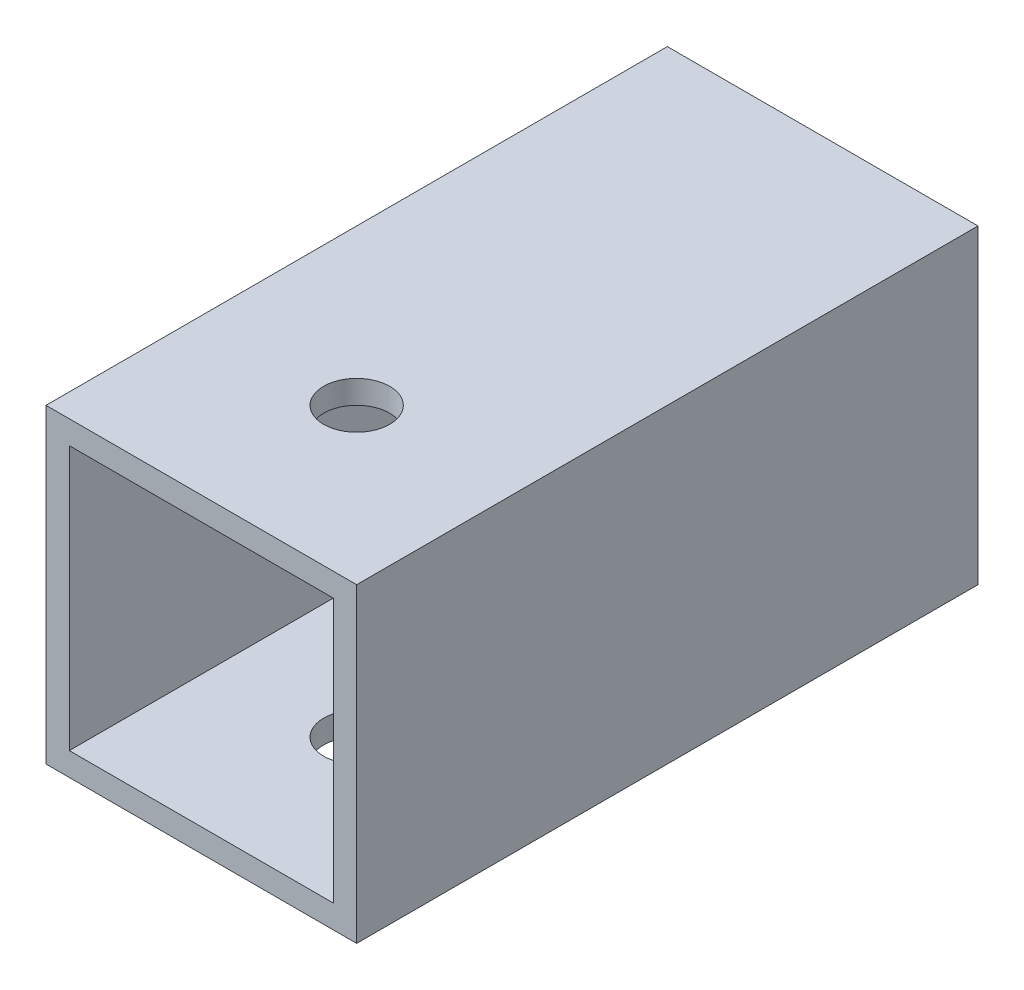
ISO-10303-21;
HEADER;
FILE_DESCRIPTION(('STEP AP214'),'2;1');
FILE_NAME('part.step','',(''),(''),'','','');
FILE_SCHEMA(('AUTOMOTIVE_DESIGN { 1 0 10303 214 1 1 1 1 }'));
ENDSEC;
DATA;
#1=APPLICATION_CONTEXT('core data for automotive mechanical design processes');
#2=APPLICATION_PROTOCOL_DEFINITION('international standard','automotive_design',2000,#1);
#3=PRODUCT_CONTEXT('',#1,'mechanical');
#4=PRODUCT('Part','Part','',(#3));
#5=PRODUCT_RELATED_PRODUCT_CATEGORY('part','',(#4));
#6=PRODUCT_DEFINITION_FORMATION('','',#4);
#7=PRODUCT_DEFINITION_CONTEXT('part definition',#1,'design');
#8=PRODUCT_DEFINITION('design','',#6,#7);
#9=PRODUCT_DEFINITION_SHAPE('','',#8);
#10=(LENGTH_UNIT() NAMED_UNIT(*) SI_UNIT(.MILLI.,.METRE.));
#11=(NAMED_UNIT(*) PLANE_ANGLE_UNIT() SI_UNIT($,.RADIAN.));
#12=(NAMED_UNIT(*) SI_UNIT($,.STERADIAN.) SOLID_ANGLE_UNIT());
#13=UNCERTAINTY_MEASURE_WITH_UNIT(LENGTH_MEASURE(1.E-05),#10,'distance_accuracy_value','');
#14=(GEOMETRIC_REPRESENTATION_CONTEXT(3) GLOBAL_UNCERTAINTY_ASSIGNED_CONTEXT((#13)) GLOBAL_UNIT_ASSIGNED_CONTEXT((#10,
#11,#12)) REPRESENTATION_CONTEXT('',''));
#15=CARTESIAN_POINT('',(0.,0.,0.));
#16=DIRECTION('',(0.,0.,1.));
#17=DIRECTION('',(1.,0.,0.));
#18=AXIS2_PLACEMENT_3D('',#15,#16,#17);
#19=CARTESIAN_POINT('',(10.,-9.99999999999999,-40.));
#20=DIRECTION('',(1.,0.,0.));
#21=DIRECTION('',(0.,0.,-1.));
#22=AXIS2_PLACEMENT_3D('',#19,#20,#21);
#23=PLANE('',#22);
#24=DIRECTION('',(0.,1.,0.));
#25=VECTOR('',#24,1.);
#26=CARTESIAN_POINT('',(10.,-9.99999999999999,0.));
#27=LINE('',#26,#25);
#28=CARTESIAN_POINT('',(10.,-9.99999999999999,0.));
#29=VERTEX_POINT('',#28);
#30=CARTESIAN_POINT('',(10.,10.,0.));
#31=VERTEX_POINT('',#30);
#32=EDGE_CURVE('E144',#29,#31,#27,.T.);
#33=ORIENTED_EDGE('',*,*,#32,.F.);
#34=DIRECTION('',(0.,0.,1.));
#35=VECTOR('',#34,1.);
#36=CARTESIAN_POINT('',(10.,-9.99999999999999,-40.));
#37=LINE('',#36,#35);
#38=CARTESIAN_POINT('',(10.,-9.99999999999999,-40.));
#39=VERTEX_POINT('',#38);
#40=EDGE_CURVE('E11',#39,#29,#37,.T.);
#41=ORIENTED_EDGE('',*,*,#40,.F.);
#42=DIRECTION('',(0.,1.,0.));
#43=VECTOR('',#42,1.);
#44=CARTESIAN_POINT('',(10.,-9.99999999999999,-40.));
#45=LINE('',#44,#43);
#46=CARTESIAN_POINT('',(10.,10.,-40.));
#47=VERTEX_POINT('',#46);
#48=EDGE_CURVE('E148',#39,#47,#45,.T.);
#49=ORIENTED_EDGE('',*,*,#48,.T.);
#50=DIRECTION('',(0.,0.,1.));
#51=VECTOR('',#50,1.);
#52=CARTESIAN_POINT('',(10.,10.,-40.));
#53=LINE('',#52,#51);
#54=EDGE_CURVE('E161',#47,#31,#53,.T.);
#55=ORIENTED_EDGE('',*,*,#54,.T.);
#56=EDGE_LOOP('',(#33,#41,#49,#55));
#57=FACE_BOUND('',#56,.T.);
#58=ADVANCED_FACE('F43',(#57),#23,.T.);
#59=CARTESIAN_POINT('',(-9.99999999999998,-9.99999999999999,-40.));
#60=DIRECTION('',(0.,-1.,0.));
#61=DIRECTION('',(0.,0.,-1.));
#62=AXIS2_PLACEMENT_3D('',#59,#60,#61);
#63=PLANE('',#62);
#64=CARTESIAN_POINT('',(0.,-9.99999999999999,-10.));
#65=DIRECTION('',(0.,1.,0.));
#66=DIRECTION('',(0.,0.,1.));
#67=AXIS2_PLACEMENT_3D('',#64,#65,#66);
#68=CIRCLE('',#67,2.125);
#69=CARTESIAN_POINT('',(0.,-9.99999999999999,-7.875));
#70=VERTEX_POINT('',#69);
#71=EDGE_CURVE('E302',#70,#70,#68,.T.);
#72=ORIENTED_EDGE('',*,*,#71,.T.);
#73=EDGE_LOOP('',(#72));
#74=FACE_BOUND('',#73,.T.);
#75=DIRECTION('',(1.,0.,0.));
#76=VECTOR('',#75,1.);
#77=CARTESIAN_POINT('',(-9.99999999999998,-9.99999999999999,0.));
#78=LINE('',#77,#76);
#79=CARTESIAN_POINT('',(-9.99999999999998,-9.99999999999999,0.));
#80=VERTEX_POINT('',#79);
#81=EDGE_CURVE('E152',#80,#29,#78,.T.);
#82=ORIENTED_EDGE('',*,*,#81,.F.);
#83=DIRECTION('',(0.,0.,1.));
#84=VECTOR('',#83,1.);
#85=CARTESIAN_POINT('',(-9.99999999999998,-9.99999999999999,-40.));
#86=LINE('',#85,#84);
#87=CARTESIAN_POINT('',(-9.99999999999998,-9.99999999999999,-40.));
#88=VERTEX_POINT('',#87);
#89=EDGE_CURVE('E51',#88,#80,#86,.T.);
#90=ORIENTED_EDGE('',*,*,#89,.F.);
#91=DIRECTION('',(1.,0.,0.));
#92=VECTOR('',#91,1.);
#93=CARTESIAN_POINT('',(-9.99999999999998,-9.99999999999999,-40.));
#94=LINE('',#93,#92);
#95=EDGE_CURVE('E158',#88,#39,#94,.T.);
#96=ORIENTED_EDGE('',*,*,#95,.T.);
#97=ORIENTED_EDGE('',*,*,#40,.T.);
#98=EDGE_LOOP('',(#82,#90,#96,#97));
#99=FACE_BOUND('',#98,.T.);
#100=ADVANCED_FACE('F186',(#74,#99),#63,.T.);
#101=CARTESIAN_POINT('',(-9.99999999999998,-9.99999999999999,-40.));
#102=DIRECTION('',(-1.,0.,0.));
#103=DIRECTION('',(0.,0.,1.));
#104=AXIS2_PLACEMENT_3D('',#101,#102,#103);
#105=PLANE('',#104);
#106=DIRECTION('',(0.,-1.,0.));
#107=VECTOR('',#106,1.);
#108=CARTESIAN_POINT('',(-9.99999999999998,-9.99999999999999,0.));
#109=LINE('',#108,#107);
#110=CARTESIAN_POINT('',(-9.99999999999998,10.,0.));
#111=VERTEX_POINT('',#110);
#112=EDGE_CURVE('E167',#111,#80,#109,.T.);
#113=ORIENTED_EDGE('',*,*,#112,.F.);
#114=DIRECTION('',(0.,0.,1.));
#115=VECTOR('',#114,1.);
#116=CARTESIAN_POINT('',(-9.99999999999998,10.,-40.));
#117=LINE('',#116,#115);
#118=CARTESIAN_POINT('',(-9.99999999999998,10.,-40.));
#119=VERTEX_POINT('',#118);
#120=EDGE_CURVE('E173',#119,#111,#117,.T.);
#121=ORIENTED_EDGE('',*,*,#120,.F.);
#122=DIRECTION('',(0.,-1.,0.));
#123=VECTOR('',#122,1.);
#124=CARTESIAN_POINT('',(-9.99999999999998,-9.99999999999999,-40.));
#125=LINE('',#124,#123);
#126=EDGE_CURVE('E155',#119,#88,#125,.T.);
#127=ORIENTED_EDGE('',*,*,#126,.T.);
#128=ORIENTED_EDGE('',*,*,#89,.T.);
#129=EDGE_LOOP('',(#113,#121,#127,#128));
#130=FACE_BOUND('',#129,.T.);
#131=ADVANCED_FACE('F190',(#130),#105,.T.);
#132=CARTESIAN_POINT('',(-9.99999999999998,10.,-40.));
#133=DIRECTION('',(0.,1.,0.));
#134=DIRECTION('',(0.,0.,1.));
#135=AXIS2_PLACEMENT_3D('',#132,#133,#134);
#136=PLANE('',#135);
#137=CARTESIAN_POINT('',(0.,10.,-10.));
#138=DIRECTION('',(0.,1.,0.));
#139=DIRECTION('',(0.,0.,1.));
#140=AXIS2_PLACEMENT_3D('',#137,#138,#139);
#141=CIRCLE('',#140,2.125);
#142=CARTESIAN_POINT('',(0.,10.,-7.875));
#143=VERTEX_POINT('',#142);
#144=EDGE_CURVE('E298',#143,#143,#141,.T.);
#145=ORIENTED_EDGE('',*,*,#144,.F.);
#146=EDGE_LOOP('',(#145));
#147=FACE_BOUND('',#146,.T.);
#148=DIRECTION('',(-1.,0.,0.));
#149=VECTOR('',#148,1.);
#150=CARTESIAN_POINT('',(-9.99999999999998,10.,0.));
#151=LINE('',#150,#149);
#152=EDGE_CURVE('E164',#31,#111,#151,.T.);
#153=ORIENTED_EDGE('',*,*,#152,.F.);
#154=ORIENTED_EDGE('',*,*,#54,.F.);
#155=DIRECTION('',(-1.,0.,0.));
#156=VECTOR('',#155,1.);
#157=CARTESIAN_POINT('',(-9.99999999999998,10.,-40.));
#158=LINE('',#157,#156);
#159=EDGE_CURVE('E151',#47,#119,#158,.T.);
#160=ORIENTED_EDGE('',*,*,#159,.T.);
#161=ORIENTED_EDGE('',*,*,#120,.T.);
#162=EDGE_LOOP('',(#153,#154,#160,#161));
#163=FACE_BOUND('',#162,.T.);
#164=ADVANCED_FACE('F180',(#147,#163),#136,.T.);
#165=CARTESIAN_POINT('',(0.,0.,-40.));
#166=DIRECTION('',(0.,0.,-1.));
#167=DIRECTION('',(-1.,0.,0.));
#168=AXIS2_PLACEMENT_3D('',#165,#166,#167);
#169=PLANE('',#168);
#170=DIRECTION('',(0.,-1.,0.));
#171=VECTOR('',#170,1.);
#172=CARTESIAN_POINT('',(-8.49999999999998,-8.49999999999999,-40.));
#173=LINE('',#172,#171);
#174=CARTESIAN_POINT('',(-8.49999999999998,8.50000000000002,-40.));
#175=VERTEX_POINT('',#174);
#176=CARTESIAN_POINT('',(-8.49999999999998,-8.49999999999999,-40.));
#177=VERTEX_POINT('',#176);
#178=EDGE_CURVE('E110',#175,#177,#173,.T.);
#179=ORIENTED_EDGE('',*,*,#178,.T.);
#180=DIRECTION('',(1.,0.,0.));
#181=VECTOR('',#180,1.);
#182=CARTESIAN_POINT('',(-8.49999999999998,-8.49999999999999,-40.));
#183=LINE('',#182,#181);
#184=CARTESIAN_POINT('',(8.50000000000002,-8.49999999999999,-40.));
#185=VERTEX_POINT('',#184);
#186=EDGE_CURVE('E119',#177,#185,#183,.T.);
#187=ORIENTED_EDGE('',*,*,#186,.T.);
#188=DIRECTION('',(0.,1.,0.));
#189=VECTOR('',#188,1.);
#190=CARTESIAN_POINT('',(8.50000000000002,-8.49999999999999,-40.));
#191=LINE('',#190,#189);
#192=CARTESIAN_POINT('',(8.50000000000002,8.50000000000002,-40.));
#193=VERTEX_POINT('',#192);
#194=EDGE_CURVE('E59',#185,#193,#191,.T.);
#195=ORIENTED_EDGE('',*,*,#194,.T.);
#196=DIRECTION('',(-1.,0.,0.));
#197=VECTOR('',#196,1.);
#198=CARTESIAN_POINT('',(-8.49999999999998,8.50000000000002,-40.));
#199=LINE('',#198,#197);
#200=EDGE_CURVE('E116',#193,#175,#199,.T.);
#201=ORIENTED_EDGE('',*,*,#200,.T.);
#202=EDGE_LOOP('',(#179,#187,#195,#201));
#203=FACE_BOUND('',#202,.T.);
#204=ORIENTED_EDGE('',*,*,#48,.F.);
#205=ORIENTED_EDGE('',*,*,#95,.F.);
#206=ORIENTED_EDGE('',*,*,#126,.F.);
#207=ORIENTED_EDGE('',*,*,#159,.F.);
#208=EDGE_LOOP('',(#204,#205,#206,#207));
#209=FACE_BOUND('',#208,.T.);
#210=ADVANCED_FACE('F123',(#203,#209),#169,.T.);
#211=CARTESIAN_POINT('',(0.,0.,0.));
#212=DIRECTION('',(0.,0.,-1.));
#213=DIRECTION('',(-1.,0.,0.));
#214=AXIS2_PLACEMENT_3D('',#211,#212,#213);
#215=PLANE('',#214);
#216=DIRECTION('',(1.,0.,0.));
#217=VECTOR('',#216,1.);
#218=CARTESIAN_POINT('',(-8.49999999999998,-8.49999999999999,0.));
#219=LINE('',#218,#217);
#220=CARTESIAN_POINT('',(-8.49999999999998,-8.49999999999999,0.));
#221=VERTEX_POINT('',#220);
#222=CARTESIAN_POINT('',(8.50000000000002,-8.49999999999999,0.));
#223=VERTEX_POINT('',#222);
#224=EDGE_CURVE('E138',#221,#223,#219,.T.);
#225=ORIENTED_EDGE('',*,*,#224,.F.);
#226=DIRECTION('',(0.,-1.,0.));
#227=VECTOR('',#226,1.);
#228=CARTESIAN_POINT('',(-8.49999999999998,-8.49999999999999,0.));
#229=LINE('',#228,#227);
#230=CARTESIAN_POINT('',(-8.49999999999998,8.50000000000002,0.));
#231=VERTEX_POINT('',#230);
#232=EDGE_CURVE('E67',#231,#221,#229,.T.);
#233=ORIENTED_EDGE('',*,*,#232,.F.);
#234=DIRECTION('',(-1.,0.,0.));
#235=VECTOR('',#234,1.);
#236=CARTESIAN_POINT('',(-8.49999999999998,8.50000000000002,0.));
#237=LINE('',#236,#235);
#238=CARTESIAN_POINT('',(8.50000000000002,8.50000000000002,0.));
#239=VERTEX_POINT('',#238);
#240=EDGE_CURVE('E126',#239,#231,#237,.T.);
#241=ORIENTED_EDGE('',*,*,#240,.F.);
#242=DIRECTION('',(0.,1.,0.));
#243=VECTOR('',#242,1.);
#244=CARTESIAN_POINT('',(8.50000000000002,-8.49999999999999,0.));
#245=LINE('',#244,#243);
#246=EDGE_CURVE('E129',#223,#239,#245,.T.);
#247=ORIENTED_EDGE('',*,*,#246,.F.);
#248=EDGE_LOOP('',(#225,#233,#241,#247));
#249=FACE_BOUND('',#248,.T.);
#250=ORIENTED_EDGE('',*,*,#32,.T.);
#251=ORIENTED_EDGE('',*,*,#152,.T.);
#252=ORIENTED_EDGE('',*,*,#112,.T.);
#253=ORIENTED_EDGE('',*,*,#81,.T.);
#254=EDGE_LOOP('',(#250,#251,#252,#253));
#255=FACE_BOUND('',#254,.T.);
#256=ADVANCED_FACE('F183',(#249,#255),#215,.F.);
#257=CARTESIAN_POINT('',(-8.49999999999998,-8.49999999999999,-40.));
#258=DIRECTION('',(-1.,0.,0.));
#259=DIRECTION('',(0.,0.,1.));
#260=AXIS2_PLACEMENT_3D('',#257,#258,#259);
#261=PLANE('',#260);
#262=ORIENTED_EDGE('',*,*,#232,.T.);
#263=DIRECTION('',(0.,0.,1.));
#264=VECTOR('',#263,1.);
#265=CARTESIAN_POINT('',(-8.49999999999998,-8.49999999999999,-40.));
#266=LINE('',#265,#264);
#267=EDGE_CURVE('E106',#177,#221,#266,.T.);
#268=ORIENTED_EDGE('',*,*,#267,.F.);
#269=ORIENTED_EDGE('',*,*,#178,.F.);
#270=DIRECTION('',(0.,0.,1.));
#271=VECTOR('',#270,1.);
#272=CARTESIAN_POINT('',(-8.49999999999998,8.50000000000002,-40.));
#273=LINE('',#272,#271);
#274=EDGE_CURVE('E142',#175,#231,#273,.T.);
#275=ORIENTED_EDGE('',*,*,#274,.T.);
#276=EDGE_LOOP('',(#262,#268,#269,#275));
#277=FACE_BOUND('',#276,.T.);
#278=ADVANCED_FACE('F108',(#277),#261,.F.);
#279=CARTESIAN_POINT('',(-8.49999999999998,8.50000000000002,-40.));
#280=DIRECTION('',(0.,1.,0.));
#281=DIRECTION('',(0.,0.,1.));
#282=AXIS2_PLACEMENT_3D('',#279,#280,#281);
#283=PLANE('',#282);
#284=CARTESIAN_POINT('',(0.,8.50000000000002,-10.));
#285=DIRECTION('',(0.,1.,0.));
#286=DIRECTION('',(0.,0.,1.));
#287=AXIS2_PLACEMENT_3D('',#284,#285,#286);
#288=CIRCLE('',#287,2.125);
#289=CARTESIAN_POINT('',(0.,8.50000000000002,-7.875));
#290=VERTEX_POINT('',#289);
#291=EDGE_CURVE('E132',#290,#290,#288,.T.);
#292=ORIENTED_EDGE('',*,*,#291,.T.);
#293=EDGE_LOOP('',(#292));
#294=FACE_BOUND('',#293,.T.);
#295=ORIENTED_EDGE('',*,*,#240,.T.);
#296=ORIENTED_EDGE('',*,*,#274,.F.);
#297=ORIENTED_EDGE('',*,*,#200,.F.);
#298=DIRECTION('',(0.,0.,1.));
#299=VECTOR('',#298,1.);
#300=CARTESIAN_POINT('',(8.50000000000002,8.50000000000002,-40.));
#301=LINE('',#300,#299);
#302=EDGE_CURVE('E145',#193,#239,#301,.T.);
#303=ORIENTED_EDGE('',*,*,#302,.T.);
#304=EDGE_LOOP('',(#295,#296,#297,#303));
#305=FACE_BOUND('',#304,.T.);
#306=ADVANCED_FACE('F248',(#294,#305),#283,.F.);
#307=CARTESIAN_POINT('',(8.50000000000002,-8.49999999999999,-40.));
#308=DIRECTION('',(1.,0.,0.));
#309=DIRECTION('',(0.,0.,-1.));
#310=AXIS2_PLACEMENT_3D('',#307,#308,#309);
#311=PLANE('',#310);
#312=ORIENTED_EDGE('',*,*,#246,.T.);
#313=ORIENTED_EDGE('',*,*,#302,.F.);
#314=ORIENTED_EDGE('',*,*,#194,.F.);
#315=DIRECTION('',(0.,0.,1.));
#316=VECTOR('',#315,1.);
#317=CARTESIAN_POINT('',(8.50000000000002,-8.49999999999999,-40.));
#318=LINE('',#317,#316);
#319=EDGE_CURVE('E115',#185,#223,#318,.T.);
#320=ORIENTED_EDGE('',*,*,#319,.T.);
#321=EDGE_LOOP('',(#312,#313,#314,#320));
#322=FACE_BOUND('',#321,.T.);
#323=ADVANCED_FACE('F256',(#322),#311,.F.);
#324=CARTESIAN_POINT('',(-8.49999999999998,-8.49999999999999,-40.));
#325=DIRECTION('',(0.,-1.,0.));
#326=DIRECTION('',(0.,0.,-1.));
#327=AXIS2_PLACEMENT_3D('',#324,#325,#326);
#328=PLANE('',#327);
#329=CARTESIAN_POINT('',(0.,-8.49999999999999,-10.));
#330=DIRECTION('',(0.,-1.,0.));
#331=DIRECTION('',(0.,0.,-1.));
#332=AXIS2_PLACEMENT_3D('',#329,#330,#331);
#333=CIRCLE('',#332,2.125);
#334=CARTESIAN_POINT('',(0.,-8.49999999999999,-12.125));
#335=VERTEX_POINT('',#334);
#336=EDGE_CURVE('E46',#335,#335,#333,.T.);
#337=ORIENTED_EDGE('',*,*,#336,.T.);
#338=EDGE_LOOP('',(#337));
#339=FACE_BOUND('',#338,.T.);
#340=ORIENTED_EDGE('',*,*,#224,.T.);
#341=ORIENTED_EDGE('',*,*,#319,.F.);
#342=ORIENTED_EDGE('',*,*,#186,.F.);
#343=ORIENTED_EDGE('',*,*,#267,.T.);
#344=EDGE_LOOP('',(#340,#341,#342,#343));
#345=FACE_BOUND('',#344,.T.);
#346=ADVANCED_FACE('F120',(#339,#345),#328,.F.);
#347=CARTESIAN_POINT('',(0.,-9.99999999999999,-10.));
#348=DIRECTION('',(0.,1.,0.));
#349=DIRECTION('',(0.,0.,1.));
#350=AXIS2_PLACEMENT_3D('',#347,#348,#349);
#351=CYLINDRICAL_SURFACE('',#350,2.125);
#352=ORIENTED_EDGE('',*,*,#71,.F.);
#353=EDGE_LOOP('',(#352));
#354=FACE_BOUND('',#353,.T.);
#355=ORIENTED_EDGE('',*,*,#336,.F.);
#356=EDGE_LOOP('',(#355));
#357=FACE_BOUND('',#356,.T.);
#358=ADVANCED_FACE('F273',(#354,#357),#351,.F.);
#359=ORIENTED_EDGE('',*,*,#144,.T.);
#360=EDGE_LOOP('',(#359));
#361=FACE_BOUND('',#360,.T.);
#362=ORIENTED_EDGE('',*,*,#291,.F.);
#363=EDGE_LOOP('',(#362));
#364=FACE_BOUND('',#363,.T.);
#365=ADVANCED_FACE('F283',(#361,#364),#351,.F.);
#366=CLOSED_SHELL('',(#58,#100,#131,#164,#210,#256,#278,#306,#323,#346,#358,#365));
#367=MANIFOLD_SOLID_BREP('B2',#366);
#368=ADVANCED_BREP_SHAPE_REPRESENTATION('',(#18,#367),#14);
#369=SHAPE_DEFINITION_REPRESENTATION(#9,#368);
ENDSEC;
END-ISO-10303-21;
